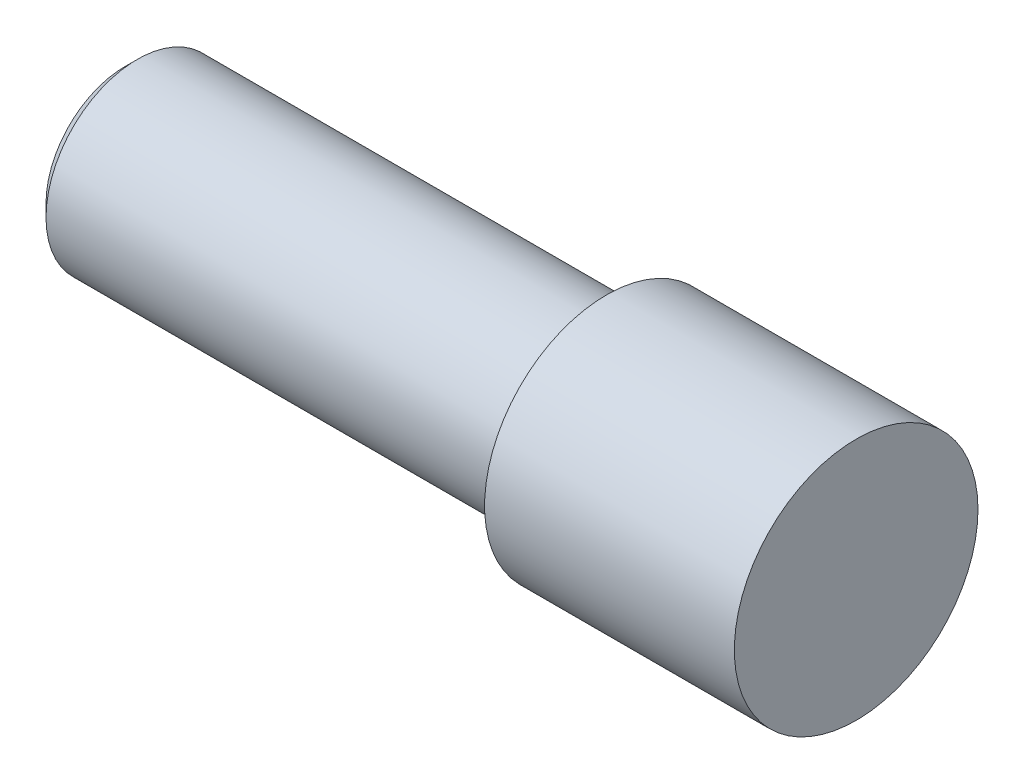
ISO-10303-21;
HEADER;
FILE_DESCRIPTION(('STEP AP214'),'2;1');
FILE_NAME('part.step','',(''),(''),'','','');
FILE_SCHEMA(('AUTOMOTIVE_DESIGN { 1 0 10303 214 1 1 1 1 }'));
ENDSEC;
DATA;
#1=APPLICATION_CONTEXT('core data for automotive mechanical design processes');
#2=APPLICATION_PROTOCOL_DEFINITION('international standard','automotive_design',2000,#1);
#3=PRODUCT_CONTEXT('',#1,'mechanical');
#4=PRODUCT('Part','Part','',(#3));
#5=PRODUCT_RELATED_PRODUCT_CATEGORY('part','',(#4));
#6=PRODUCT_DEFINITION_FORMATION('','',#4);
#7=PRODUCT_DEFINITION_CONTEXT('part definition',#1,'design');
#8=PRODUCT_DEFINITION('design','',#6,#7);
#9=PRODUCT_DEFINITION_SHAPE('','',#8);
#10=(LENGTH_UNIT() NAMED_UNIT(*) SI_UNIT(.MILLI.,.METRE.));
#11=(NAMED_UNIT(*) PLANE_ANGLE_UNIT() SI_UNIT($,.RADIAN.));
#12=(NAMED_UNIT(*) SI_UNIT($,.STERADIAN.) SOLID_ANGLE_UNIT());
#13=UNCERTAINTY_MEASURE_WITH_UNIT(LENGTH_MEASURE(1.E-05),#10,'distance_accuracy_value','');
#14=(GEOMETRIC_REPRESENTATION_CONTEXT(3) GLOBAL_UNCERTAINTY_ASSIGNED_CONTEXT((#13)) GLOBAL_UNIT_ASSIGNED_CONTEXT((#10,
#11,#12)) REPRESENTATION_CONTEXT('',''));
#15=CARTESIAN_POINT('',(0.,0.,0.));
#16=DIRECTION('',(0.,0.,1.));
#17=DIRECTION('',(1.,0.,0.));
#18=AXIS2_PLACEMENT_3D('',#15,#16,#17);
#19=CARTESIAN_POINT('',(0.,0.,0.));
#20=DIRECTION('',(1.,0.,0.));
#21=DIRECTION('',(0.,0.,-1.));
#22=AXIS2_PLACEMENT_3D('',#19,#20,#21);
#23=PLANE('',#22);
#24=CARTESIAN_POINT('',(0.,0.,0.));
#25=DIRECTION('',(1.,0.,0.));
#26=DIRECTION('',(0.,0.,-1.));
#27=AXIS2_PLACEMENT_3D('',#24,#25,#26);
#28=CIRCLE('',#27,2.);
#29=CARTESIAN_POINT('',(0.,0.,-2.));
#30=VERTEX_POINT('',#29);
#31=EDGE_CURVE('E52',#30,#30,#28,.T.);
#32=ORIENTED_EDGE('',*,*,#31,.F.);
#33=EDGE_LOOP('',(#32));
#34=FACE_BOUND('',#33,.T.);
#35=CARTESIAN_POINT('',(0.,0.,0.));
#36=DIRECTION('',(1.,0.,0.));
#37=DIRECTION('',(0.,0.,-1.));
#38=AXIS2_PLACEMENT_3D('',#35,#36,#37);
#39=CIRCLE('',#38,1.5);
#40=CARTESIAN_POINT('',(0.,0.,-1.5));
#41=VERTEX_POINT('',#40);
#42=EDGE_CURVE('E45',#41,#41,#39,.F.);
#43=ORIENTED_EDGE('',*,*,#42,.F.);
#44=EDGE_LOOP('',(#43));
#45=FACE_BOUND('',#44,.T.);
#46=ADVANCED_FACE('F34',(#34,#45),#23,.F.);
#47=CARTESIAN_POINT('',(4.1,0.,0.));
#48=DIRECTION('',(-1.,0.,0.));
#49=DIRECTION('',(0.,0.,1.));
#50=AXIS2_PLACEMENT_3D('',#47,#48,#49);
#51=CYLINDRICAL_SURFACE('',#50,2.);
#52=CARTESIAN_POINT('',(4.1,0.,0.));
#53=DIRECTION('',(1.,0.,0.));
#54=DIRECTION('',(0.,0.,-1.));
#55=AXIS2_PLACEMENT_3D('',#52,#53,#54);
#56=CIRCLE('',#55,2.);
#57=CARTESIAN_POINT('',(4.1,0.,-2.));
#58=VERTEX_POINT('',#57);
#59=EDGE_CURVE('E49',#58,#58,#56,.T.);
#60=ORIENTED_EDGE('',*,*,#59,.F.);
#61=EDGE_LOOP('',(#60));
#62=FACE_BOUND('',#61,.T.);
#63=ORIENTED_EDGE('',*,*,#31,.T.);
#64=EDGE_LOOP('',(#63));
#65=FACE_BOUND('',#64,.T.);
#66=ADVANCED_FACE('F60',(#62,#65),#51,.T.);
#67=CARTESIAN_POINT('',(4.1,0.,0.));
#68=DIRECTION('',(1.,0.,0.));
#69=DIRECTION('',(0.,0.,-1.));
#70=AXIS2_PLACEMENT_3D('',#67,#68,#69);
#71=PLANE('',#70);
#72=ORIENTED_EDGE('',*,*,#59,.T.);
#73=EDGE_LOOP('',(#72));
#74=FACE_BOUND('',#73,.T.);
#75=ADVANCED_FACE('F58',(#74),#71,.T.);
#76=CARTESIAN_POINT('',(-7.9,0.,0.));
#77=DIRECTION('',(1.,0.,0.));
#78=DIRECTION('',(0.,0.,-1.));
#79=AXIS2_PLACEMENT_3D('',#76,#77,#78);
#80=CYLINDRICAL_SURFACE('',#79,1.5);
#81=CARTESIAN_POINT('',(-7.7,0.,0.));
#82=DIRECTION('',(-1.,0.,0.));
#83=DIRECTION('',(0.,0.,1.));
#84=AXIS2_PLACEMENT_3D('',#81,#82,#83);
#85=CIRCLE('',#84,1.5);
#86=CARTESIAN_POINT('',(-7.7,0.,1.5));
#87=VERTEX_POINT('',#86);
#88=EDGE_CURVE('E10',#87,#87,#85,.F.);
#89=ORIENTED_EDGE('',*,*,#88,.T.);
#90=EDGE_LOOP('',(#89));
#91=FACE_BOUND('',#90,.T.);
#92=ORIENTED_EDGE('',*,*,#42,.T.);
#93=EDGE_LOOP('',(#92));
#94=FACE_BOUND('',#93,.T.);
#95=ADVANCED_FACE('F70',(#91,#94),#80,.T.);
#96=CARTESIAN_POINT('',(-7.9,0.,0.));
#97=DIRECTION('',(-1.,0.,0.));
#98=DIRECTION('',(0.,0.,1.));
#99=AXIS2_PLACEMENT_3D('',#96,#97,#98);
#100=PLANE('',#99);
#101=CARTESIAN_POINT('',(-7.9,0.,0.));
#102=DIRECTION('',(-1.,0.,0.));
#103=DIRECTION('',(0.,0.,1.));
#104=AXIS2_PLACEMENT_3D('',#101,#102,#103);
#105=CIRCLE('',#104,1.3);
#106=CARTESIAN_POINT('',(-7.9,0.,1.3));
#107=VERTEX_POINT('',#106);
#108=EDGE_CURVE('E41',#107,#107,#105,.T.);
#109=ORIENTED_EDGE('',*,*,#108,.T.);
#110=EDGE_LOOP('',(#109));
#111=FACE_BOUND('',#110,.T.);
#112=ADVANCED_FACE('F72',(#111),#100,.T.);
#113=CARTESIAN_POINT('',(-7.9,0.,0.));
#114=DIRECTION('',(1.,0.,0.));
#115=DIRECTION('',(0.,0.,-1.));
#116=AXIS2_PLACEMENT_3D('',#113,#114,#115);
#117=CONICAL_SURFACE('',#116,1.3,0.78539816339745);
#118=ORIENTED_EDGE('',*,*,#88,.F.);
#119=EDGE_LOOP('',(#118));
#120=FACE_BOUND('',#119,.T.);
#121=ORIENTED_EDGE('',*,*,#108,.F.);
#122=EDGE_LOOP('',(#121));
#123=FACE_BOUND('',#122,.T.);
#124=ADVANCED_FACE('F36',(#120,#123),#117,.T.);
#125=CLOSED_SHELL('',(#46,#66,#75,#95,#112,#124));
#126=MANIFOLD_SOLID_BREP('B2',#125);
#127=ADVANCED_BREP_SHAPE_REPRESENTATION('',(#18,#126),#14);
#128=SHAPE_DEFINITION_REPRESENTATION(#9,#127);
ENDSEC;
END-ISO-10303-21;
